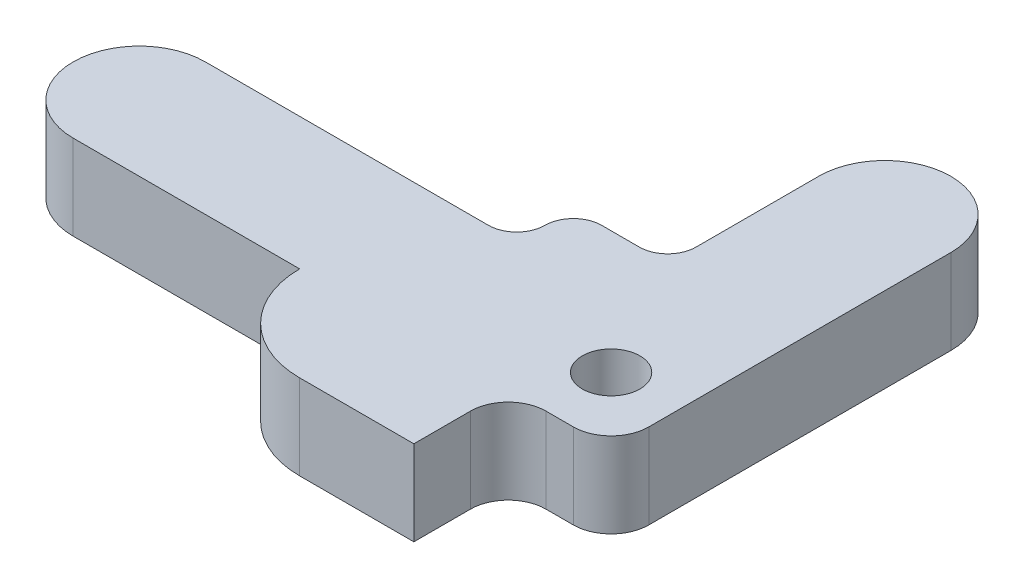
ISO-10303-21;
HEADER;
FILE_DESCRIPTION(('STEP AP214'),'2;1');
FILE_NAME('part.step','',(''),(''),'','','');
FILE_SCHEMA(('AUTOMOTIVE_DESIGN { 1 0 10303 214 1 1 1 1 }'));
ENDSEC;
DATA;
#1=APPLICATION_CONTEXT('core data for automotive mechanical design processes');
#2=APPLICATION_PROTOCOL_DEFINITION('international standard','automotive_design',2000,#1);
#3=PRODUCT_CONTEXT('',#1,'mechanical');
#4=PRODUCT('Part','Part','',(#3));
#5=PRODUCT_RELATED_PRODUCT_CATEGORY('part','',(#4));
#6=PRODUCT_DEFINITION_FORMATION('','',#4);
#7=PRODUCT_DEFINITION_CONTEXT('part definition',#1,'design');
#8=PRODUCT_DEFINITION('design','',#6,#7);
#9=PRODUCT_DEFINITION_SHAPE('','',#8);
#10=(LENGTH_UNIT() NAMED_UNIT(*) SI_UNIT(.MILLI.,.METRE.));
#11=(NAMED_UNIT(*) PLANE_ANGLE_UNIT() SI_UNIT($,.RADIAN.));
#12=(NAMED_UNIT(*) SI_UNIT($,.STERADIAN.) SOLID_ANGLE_UNIT());
#13=UNCERTAINTY_MEASURE_WITH_UNIT(LENGTH_MEASURE(1.E-05),#10,'distance_accuracy_value','');
#14=(GEOMETRIC_REPRESENTATION_CONTEXT(3) GLOBAL_UNCERTAINTY_ASSIGNED_CONTEXT((#13)) GLOBAL_UNIT_ASSIGNED_CONTEXT((#10,
#11,#12)) REPRESENTATION_CONTEXT('',''));
#15=CARTESIAN_POINT('',(0.,0.,0.));
#16=DIRECTION('',(0.,0.,1.));
#17=DIRECTION('',(1.,0.,0.));
#18=AXIS2_PLACEMENT_3D('',#15,#16,#17);
#19=CARTESIAN_POINT('',(0.,4.5,8.5));
#20=DIRECTION('',(0.,0.,1.));
#21=DIRECTION('',(1.,0.,0.));
#22=AXIS2_PLACEMENT_3D('',#19,#20,#21);
#23=PLANE('',#22);
#24=DIRECTION('',(-1.,0.,0.));
#25=VECTOR('',#24,1.);
#26=CARTESIAN_POINT('',(0.,4.5,8.5));
#27=LINE('',#26,#25);
#28=CARTESIAN_POINT('',(-1.95,4.5,8.5));
#29=VERTEX_POINT('',#28);
#30=CARTESIAN_POINT('',(-8.,4.5,8.5));
#31=VERTEX_POINT('',#30);
#32=EDGE_CURVE('E243',#29,#31,#27,.T.);
#33=ORIENTED_EDGE('',*,*,#32,.T.);
#34=DIRECTION('',(0.,-1.,0.));
#35=VECTOR('',#34,1.);
#36=CARTESIAN_POINT('',(-8.,4.5,8.5));
#37=LINE('',#36,#35);
#38=CARTESIAN_POINT('',(-8.,0.,8.5));
#39=VERTEX_POINT('',#38);
#40=EDGE_CURVE('E393',#31,#39,#37,.T.);
#41=ORIENTED_EDGE('',*,*,#40,.T.);
#42=DIRECTION('',(-1.,0.,0.));
#43=VECTOR('',#42,1.);
#44=CARTESIAN_POINT('',(0.,0.,8.5));
#45=LINE('',#44,#43);
#46=CARTESIAN_POINT('',(-1.95,0.,8.5));
#47=VERTEX_POINT('',#46);
#48=EDGE_CURVE('E276',#47,#39,#45,.T.);
#49=ORIENTED_EDGE('',*,*,#48,.F.);
#50=DIRECTION('',(0.,-1.,0.));
#51=VECTOR('',#50,1.);
#52=CARTESIAN_POINT('',(-1.95,4.5,8.5));
#53=LINE('',#52,#51);
#54=EDGE_CURVE('E302',#29,#47,#53,.T.);
#55=ORIENTED_EDGE('',*,*,#54,.F.);
#56=EDGE_LOOP('',(#33,#41,#49,#55));
#57=FACE_BOUND('',#56,.T.);
#58=ADVANCED_FACE('F41',(#57),#23,.T.);
#59=CARTESIAN_POINT('',(-1.95,4.5,0.));
#60=DIRECTION('',(-1.,0.,0.));
#61=DIRECTION('',(0.,0.,1.));
#62=AXIS2_PLACEMENT_3D('',#59,#60,#61);
#63=PLANE('',#62);
#64=DIRECTION('',(0.,0.,-1.));
#65=VECTOR('',#64,1.);
#66=CARTESIAN_POINT('',(-1.95,0.,0.));
#67=LINE('',#66,#65);
#68=CARTESIAN_POINT('',(-1.95,0.,5.5));
#69=VERTEX_POINT('',#68);
#70=EDGE_CURVE('E280',#47,#69,#67,.T.);
#71=ORIENTED_EDGE('',*,*,#70,.T.);
#72=DIRECTION('',(0.,-1.,0.));
#73=VECTOR('',#72,1.);
#74=CARTESIAN_POINT('',(-1.95,4.5,5.5));
#75=LINE('',#74,#73);
#76=CARTESIAN_POINT('',(-1.95,4.5,5.5));
#77=VERTEX_POINT('',#76);
#78=EDGE_CURVE('E57',#69,#77,#75,.F.);
#79=ORIENTED_EDGE('',*,*,#78,.T.);
#80=DIRECTION('',(0.,0.,-1.));
#81=VECTOR('',#80,1.);
#82=CARTESIAN_POINT('',(-1.95,4.5,0.));
#83=LINE('',#82,#81);
#84=EDGE_CURVE('E248',#29,#77,#83,.T.);
#85=ORIENTED_EDGE('',*,*,#84,.F.);
#86=ORIENTED_EDGE('',*,*,#54,.T.);
#87=EDGE_LOOP('',(#71,#79,#85,#86));
#88=FACE_BOUND('',#87,.T.);
#89=ADVANCED_FACE('F432',(#88),#63,.F.);
#90=CARTESIAN_POINT('',(0.,4.5,3.5));
#91=DIRECTION('',(0.,0.,-1.));
#92=DIRECTION('',(-1.,0.,0.));
#93=AXIS2_PLACEMENT_3D('',#90,#91,#92);
#94=PLANE('',#93);
#95=DIRECTION('',(1.,0.,0.));
#96=VECTOR('',#95,1.);
#97=CARTESIAN_POINT('',(0.,0.,3.5));
#98=LINE('',#97,#96);
#99=CARTESIAN_POINT('',(0.050000000000001,0.,3.5));
#100=VERTEX_POINT('',#99);
#101=CARTESIAN_POINT('',(1.50000000000125,0.,3.5));
#102=VERTEX_POINT('',#101);
#103=EDGE_CURVE('E283',#100,#102,#98,.T.);
#104=ORIENTED_EDGE('',*,*,#103,.T.);
#105=DIRECTION('',(0.,-1.,0.));
#106=VECTOR('',#105,1.);
#107=CARTESIAN_POINT('',(1.50000000000125,4.5,3.5));
#108=LINE('',#107,#106);
#109=CARTESIAN_POINT('',(1.50000000000125,4.5,3.5));
#110=VERTEX_POINT('',#109);
#111=EDGE_CURVE('E65',#102,#110,#108,.F.);
#112=ORIENTED_EDGE('',*,*,#111,.T.);
#113=DIRECTION('',(1.,0.,0.));
#114=VECTOR('',#113,1.);
#115=CARTESIAN_POINT('',(0.,4.5,3.5));
#116=LINE('',#115,#114);
#117=CARTESIAN_POINT('',(0.050000000000001,4.5,3.5));
#118=VERTEX_POINT('',#117);
#119=EDGE_CURVE('E251',#118,#110,#116,.T.);
#120=ORIENTED_EDGE('',*,*,#119,.F.);
#121=DIRECTION('',(0.,-1.,0.));
#122=VECTOR('',#121,1.);
#123=CARTESIAN_POINT('',(0.050000000000001,0.,3.5));
#124=LINE('',#123,#122);
#125=EDGE_CURVE('E413',#118,#100,#124,.T.);
#126=ORIENTED_EDGE('',*,*,#125,.T.);
#127=EDGE_LOOP('',(#104,#112,#120,#126));
#128=FACE_BOUND('',#127,.T.);
#129=ADVANCED_FACE('F438',(#128),#94,.F.);
#130=CARTESIAN_POINT('',(3.50000000000125,4.5,0.));
#131=DIRECTION('',(-1.,0.,0.));
#132=DIRECTION('',(0.,0.,1.));
#133=AXIS2_PLACEMENT_3D('',#130,#131,#132);
#134=PLANE('',#133);
#135=DIRECTION('',(0.,0.,-1.));
#136=VECTOR('',#135,1.);
#137=CARTESIAN_POINT('',(3.50000000000125,4.5,0.));
#138=LINE('',#137,#136);
#139=CARTESIAN_POINT('',(3.50000000000125,4.5,1.5));
#140=VERTEX_POINT('',#139);
#141=CARTESIAN_POINT('',(3.50000000000125,4.5,-14.5));
#142=VERTEX_POINT('',#141);
#143=EDGE_CURVE('E254',#140,#142,#138,.T.);
#144=ORIENTED_EDGE('',*,*,#143,.F.);
#145=DIRECTION('',(0.,-1.,0.));
#146=VECTOR('',#145,1.);
#147=CARTESIAN_POINT('',(3.50000000000125,4.5,1.5));
#148=LINE('',#147,#146);
#149=CARTESIAN_POINT('',(3.50000000000125,0.,1.5));
#150=VERTEX_POINT('',#149);
#151=EDGE_CURVE('E406',#140,#150,#148,.T.);
#152=ORIENTED_EDGE('',*,*,#151,.T.);
#153=DIRECTION('',(0.,0.,-1.));
#154=VECTOR('',#153,1.);
#155=CARTESIAN_POINT('',(3.50000000000125,0.,0.));
#156=LINE('',#155,#154);
#157=CARTESIAN_POINT('',(3.50000000000125,0.,-14.5));
#158=VERTEX_POINT('',#157);
#159=EDGE_CURVE('E286',#150,#158,#156,.T.);
#160=ORIENTED_EDGE('',*,*,#159,.T.);
#161=DIRECTION('',(0.,-1.,0.));
#162=VECTOR('',#161,1.);
#163=CARTESIAN_POINT('',(3.50000000000125,4.5,-14.5));
#164=LINE('',#163,#162);
#165=EDGE_CURVE('E339',#158,#142,#164,.F.);
#166=ORIENTED_EDGE('',*,*,#165,.T.);
#167=EDGE_LOOP('',(#144,#152,#160,#166));
#168=FACE_BOUND('',#167,.T.);
#169=ADVANCED_FACE('F445',(#168),#134,.F.);
#170=CARTESIAN_POINT('',(-3.5,4.5,0.));
#171=DIRECTION('',(1.,0.,0.));
#172=DIRECTION('',(0.,0.,-1.));
#173=AXIS2_PLACEMENT_3D('',#170,#171,#172);
#174=PLANE('',#173);
#175=DIRECTION('',(0.,0.,1.));
#176=VECTOR('',#175,1.);
#177=CARTESIAN_POINT('',(-3.5,0.,0.));
#178=LINE('',#177,#176);
#179=CARTESIAN_POINT('',(-3.5,0.,-14.5));
#180=VERTEX_POINT('',#179);
#181=CARTESIAN_POINT('',(-3.5,0.,-8.));
#182=VERTEX_POINT('',#181);
#183=EDGE_CURVE('E289',#180,#182,#178,.T.);
#184=ORIENTED_EDGE('',*,*,#183,.T.);
#185=DIRECTION('',(0.,-1.,0.));
#186=VECTOR('',#185,1.);
#187=CARTESIAN_POINT('',(-3.5,4.5,-8.));
#188=LINE('',#187,#186);
#189=CARTESIAN_POINT('',(-3.5,4.5,-8.));
#190=VERTEX_POINT('',#189);
#191=EDGE_CURVE('E375',#182,#190,#188,.F.);
#192=ORIENTED_EDGE('',*,*,#191,.T.);
#193=DIRECTION('',(0.,0.,1.));
#194=VECTOR('',#193,1.);
#195=CARTESIAN_POINT('',(-3.5,4.5,0.));
#196=LINE('',#195,#194);
#197=CARTESIAN_POINT('',(-3.5,4.5,-14.5));
#198=VERTEX_POINT('',#197);
#199=EDGE_CURVE('E257',#198,#190,#196,.T.);
#200=ORIENTED_EDGE('',*,*,#199,.F.);
#201=DIRECTION('',(0.,-1.,0.));
#202=VECTOR('',#201,1.);
#203=CARTESIAN_POINT('',(-3.5,4.5,-14.5));
#204=LINE('',#203,#202);
#205=EDGE_CURVE('E343',#198,#180,#204,.T.);
#206=ORIENTED_EDGE('',*,*,#205,.T.);
#207=EDGE_LOOP('',(#184,#192,#200,#206));
#208=FACE_BOUND('',#207,.T.);
#209=ADVANCED_FACE('F459',(#208),#174,.F.);
#210=CARTESIAN_POINT('',(0.,4.5,-6.5));
#211=DIRECTION('',(0.,0.,1.));
#212=DIRECTION('',(1.,0.,0.));
#213=AXIS2_PLACEMENT_3D('',#210,#211,#212);
#214=PLANE('',#213);
#215=DIRECTION('',(-1.,0.,0.));
#216=VECTOR('',#215,1.);
#217=CARTESIAN_POINT('',(-3.5,-4.,-6.5));
#218=LINE('',#217,#216);
#219=CARTESIAN_POINT('',(-3.5,-4.,-6.5));
#220=VERTEX_POINT('',#219);
#221=CARTESIAN_POINT('',(-7.,-4.,-6.5));
#222=VERTEX_POINT('',#221);
#223=EDGE_CURVE('E204',#220,#222,#218,.T.);
#224=ORIENTED_EDGE('',*,*,#223,.T.);
#225=DIRECTION('',(0.,-1.,0.));
#226=VECTOR('',#225,1.);
#227=CARTESIAN_POINT('',(-7.,4.5,-6.5));
#228=LINE('',#227,#226);
#229=CARTESIAN_POINT('',(-7.,4.5,-6.5));
#230=VERTEX_POINT('',#229);
#231=EDGE_CURVE('E369',#222,#230,#228,.F.);
#232=ORIENTED_EDGE('',*,*,#231,.T.);
#233=DIRECTION('',(-1.,0.,0.));
#234=VECTOR('',#233,1.);
#235=CARTESIAN_POINT('',(0.,4.5,-6.5));
#236=LINE('',#235,#234);
#237=CARTESIAN_POINT('',(-5.,4.5,-6.5));
#238=VERTEX_POINT('',#237);
#239=EDGE_CURVE('E261',#238,#230,#236,.T.);
#240=ORIENTED_EDGE('',*,*,#239,.F.);
#241=DIRECTION('',(0.,-1.,0.));
#242=VECTOR('',#241,1.);
#243=CARTESIAN_POINT('',(-5.,0.,-6.5));
#244=LINE('',#243,#242);
#245=CARTESIAN_POINT('',(-5.,0.,-6.5));
#246=VERTEX_POINT('',#245);
#247=EDGE_CURVE('E365',#238,#246,#244,.T.);
#248=ORIENTED_EDGE('',*,*,#247,.T.);
#249=DIRECTION('',(1.,0.,0.));
#250=VECTOR('',#249,1.);
#251=CARTESIAN_POINT('',(0.,0.,-6.5));
#252=LINE('',#251,#250);
#253=CARTESIAN_POINT('',(-3.5,0.,-6.5));
#254=VERTEX_POINT('',#253);
#255=EDGE_CURVE('E362',#246,#254,#252,.T.);
#256=ORIENTED_EDGE('',*,*,#255,.T.);
#257=DIRECTION('',(0.,1.,0.));
#258=VECTOR('',#257,1.);
#259=CARTESIAN_POINT('',(-3.5,-4.,-6.5));
#260=LINE('',#259,#258);
#261=EDGE_CURVE('E232',#220,#254,#260,.T.);
#262=ORIENTED_EDGE('',*,*,#261,.F.);
#263=EDGE_LOOP('',(#224,#232,#240,#248,#256,#262));
#264=FACE_BOUND('',#263,.T.);
#265=ADVANCED_FACE('F470',(#264),#214,.F.);
#266=CARTESIAN_POINT('',(-8.5,4.5,0.));
#267=DIRECTION('',(1.,0.,0.));
#268=DIRECTION('',(0.,0.,-1.));
#269=AXIS2_PLACEMENT_3D('',#266,#267,#268);
#270=PLANE('',#269);
#271=DIRECTION('',(0.,0.,-1.));
#272=VECTOR('',#271,1.);
#273=CARTESIAN_POINT('',(-8.5,0.,0.));
#274=LINE('',#273,#272);
#275=CARTESIAN_POINT('',(-8.5,0.,-3.5));
#276=VERTEX_POINT('',#275);
#277=CARTESIAN_POINT('',(-8.5,0.,-5.));
#278=VERTEX_POINT('',#277);
#279=EDGE_CURVE('E346',#276,#278,#274,.T.);
#280=ORIENTED_EDGE('',*,*,#279,.T.);
#281=DIRECTION('',(0.,-1.,0.));
#282=VECTOR('',#281,1.);
#283=CARTESIAN_POINT('',(-8.5,4.5,-5.));
#284=LINE('',#283,#282);
#285=CARTESIAN_POINT('',(-8.5,-4.,-5.));
#286=VERTEX_POINT('',#285);
#287=EDGE_CURVE('E199',#278,#286,#284,.T.);
#288=ORIENTED_EDGE('',*,*,#287,.T.);
#289=DIRECTION('',(0.,0.,1.));
#290=VECTOR('',#289,1.);
#291=CARTESIAN_POINT('',(-8.5,-4.,-6.5));
#292=LINE('',#291,#290);
#293=CARTESIAN_POINT('',(-8.5,-4.,-3.5));
#294=VERTEX_POINT('',#293);
#295=EDGE_CURVE('E192',#286,#294,#292,.T.);
#296=ORIENTED_EDGE('',*,*,#295,.T.);
#297=DIRECTION('',(0.,1.,0.));
#298=VECTOR('',#297,1.);
#299=CARTESIAN_POINT('',(-8.5,-4.,-3.5));
#300=LINE('',#299,#298);
#301=EDGE_CURVE('E196',#294,#276,#300,.T.);
#302=ORIENTED_EDGE('',*,*,#301,.T.);
#303=EDGE_LOOP('',(#280,#288,#296,#302));
#304=FACE_BOUND('',#303,.T.);
#305=ADVANCED_FACE('F195',(#304),#270,.F.);
#306=CARTESIAN_POINT('',(0.,4.5,-3.5));
#307=DIRECTION('',(0.,0.,1.));
#308=DIRECTION('',(1.,0.,0.));
#309=AXIS2_PLACEMENT_3D('',#306,#307,#308);
#310=PLANE('',#309);
#311=DIRECTION('',(-1.,0.,0.));
#312=VECTOR('',#311,1.);
#313=CARTESIAN_POINT('',(0.,4.5,-3.5));
#314=LINE('',#313,#312);
#315=CARTESIAN_POINT('',(-10.,4.5,-3.5));
#316=VERTEX_POINT('',#315);
#317=CARTESIAN_POINT('',(-25.0000000000015,4.5,-3.5));
#318=VERTEX_POINT('',#317);
#319=EDGE_CURVE('E265',#316,#318,#314,.T.);
#320=ORIENTED_EDGE('',*,*,#319,.F.);
#321=DIRECTION('',(0.,-1.,0.));
#322=VECTOR('',#321,1.);
#323=CARTESIAN_POINT('',(-10.,0.,-3.5));
#324=LINE('',#323,#322);
#325=CARTESIAN_POINT('',(-10.,0.,-3.5));
#326=VERTEX_POINT('',#325);
#327=EDGE_CURVE('E378',#316,#326,#324,.T.);
#328=ORIENTED_EDGE('',*,*,#327,.T.);
#329=DIRECTION('',(-1.,0.,0.));
#330=VECTOR('',#329,1.);
#331=CARTESIAN_POINT('',(0.,0.,-3.5));
#332=LINE('',#331,#330);
#333=CARTESIAN_POINT('',(-25.0000000000015,0.,-3.5));
#334=VERTEX_POINT('',#333);
#335=EDGE_CURVE('E293',#326,#334,#332,.T.);
#336=ORIENTED_EDGE('',*,*,#335,.T.);
#337=DIRECTION('',(0.,-1.,0.));
#338=VECTOR('',#337,1.);
#339=CARTESIAN_POINT('',(-25.0000000000015,4.5,-3.5));
#340=LINE('',#339,#338);
#341=EDGE_CURVE('E335',#334,#318,#340,.F.);
#342=ORIENTED_EDGE('',*,*,#341,.T.);
#343=EDGE_LOOP('',(#320,#328,#336,#342));
#344=FACE_BOUND('',#343,.T.);
#345=ADVANCED_FACE('F483',(#344),#310,.F.);
#346=CARTESIAN_POINT('',(0.,4.5,3.50000000000003));
#347=DIRECTION('',(0.,0.,1.));
#348=DIRECTION('',(1.,0.,0.));
#349=AXIS2_PLACEMENT_3D('',#346,#347,#348);
#350=PLANE('',#349);
#351=DIRECTION('',(-1.,0.,0.));
#352=VECTOR('',#351,1.);
#353=CARTESIAN_POINT('',(0.,4.5,3.50000000000003));
#354=LINE('',#353,#352);
#355=CARTESIAN_POINT('',(-13.,4.5,3.5));
#356=VERTEX_POINT('',#355);
#357=CARTESIAN_POINT('',(-25.0000000000015,4.5,3.50000000000001));
#358=VERTEX_POINT('',#357);
#359=EDGE_CURVE('E268',#356,#358,#354,.T.);
#360=ORIENTED_EDGE('',*,*,#359,.T.);
#361=DIRECTION('',(0.,-1.,0.));
#362=VECTOR('',#361,1.);
#363=CARTESIAN_POINT('',(-25.0000000000015,4.5,3.50000000000001));
#364=LINE('',#363,#362);
#365=CARTESIAN_POINT('',(-25.0000000000015,0.,3.50000000000001));
#366=VERTEX_POINT('',#365);
#367=EDGE_CURVE('E305',#358,#366,#364,.T.);
#368=ORIENTED_EDGE('',*,*,#367,.T.);
#369=DIRECTION('',(-1.,0.,0.));
#370=VECTOR('',#369,1.);
#371=CARTESIAN_POINT('',(0.,0.,3.50000000000003));
#372=LINE('',#371,#370);
#373=CARTESIAN_POINT('',(-13.,0.,3.5));
#374=VERTEX_POINT('',#373);
#375=EDGE_CURVE('E244',#374,#366,#372,.T.);
#376=ORIENTED_EDGE('',*,*,#375,.F.);
#377=DIRECTION('',(0.,-1.,0.));
#378=VECTOR('',#377,1.);
#379=CARTESIAN_POINT('',(-13.,4.5,3.5));
#380=LINE('',#379,#378);
#381=EDGE_CURVE('E272',#356,#374,#380,.T.);
#382=ORIENTED_EDGE('',*,*,#381,.F.);
#383=EDGE_LOOP('',(#360,#368,#376,#382));
#384=FACE_BOUND('',#383,.T.);
#385=ADVANCED_FACE('F496',(#384),#350,.T.);
#386=CARTESIAN_POINT('',(0.,4.5,0.));
#387=DIRECTION('',(0.,-1.,0.));
#388=DIRECTION('',(0.,0.,-1.));
#389=AXIS2_PLACEMENT_3D('',#386,#387,#388);
#390=CYLINDRICAL_SURFACE('',#389,1.525);
#391=CARTESIAN_POINT('',(0.,4.5,0.));
#392=DIRECTION('',(0.,1.,0.));
#393=DIRECTION('',(0.,0.,1.));
#394=AXIS2_PLACEMENT_3D('',#391,#392,#393);
#395=CIRCLE('',#394,1.525);
#396=CARTESIAN_POINT('',(0.,4.5,1.525));
#397=VERTEX_POINT('',#396);
#398=EDGE_CURVE('E239',#397,#397,#395,.T.);
#399=ORIENTED_EDGE('',*,*,#398,.T.);
#400=EDGE_LOOP('',(#399));
#401=FACE_BOUND('',#400,.T.);
#402=CARTESIAN_POINT('',(0.,0.,0.));
#403=DIRECTION('',(0.,1.,0.));
#404=DIRECTION('',(0.,0.,1.));
#405=AXIS2_PLACEMENT_3D('',#402,#403,#404);
#406=CIRCLE('',#405,1.525);
#407=CARTESIAN_POINT('',(0.,0.,1.525));
#408=VERTEX_POINT('',#407);
#409=EDGE_CURVE('E236',#408,#408,#406,.T.);
#410=ORIENTED_EDGE('',*,*,#409,.F.);
#411=EDGE_LOOP('',(#410));
#412=FACE_BOUND('',#411,.T.);
#413=ADVANCED_FACE('F516',(#401,#412),#390,.F.);
#414=CARTESIAN_POINT('',(0.,4.5,0.));
#415=DIRECTION('',(0.,1.,0.));
#416=DIRECTION('',(0.,0.,1.));
#417=AXIS2_PLACEMENT_3D('',#414,#415,#416);
#418=PLANE('',#417);
#419=ORIENTED_EDGE('',*,*,#398,.F.);
#420=EDGE_LOOP('',(#419));
#421=FACE_BOUND('',#420,.T.);
#422=ORIENTED_EDGE('',*,*,#119,.T.);
#423=CARTESIAN_POINT('',(1.50000000000125,4.5,1.5));
#424=DIRECTION('',(0.,1.,0.));
#425=DIRECTION('',(0.,0.,1.));
#426=AXIS2_PLACEMENT_3D('',#423,#424,#425);
#427=CIRCLE('',#426,2.);
#428=EDGE_CURVE('E419',#110,#140,#427,.T.);
#429=ORIENTED_EDGE('',*,*,#428,.T.);
#430=ORIENTED_EDGE('',*,*,#143,.T.);
#431=CARTESIAN_POINT('',(1.25116930704827E-12,4.5,-14.5));
#432=DIRECTION('',(0.,1.,0.));
#433=DIRECTION('',(0.,0.,1.));
#434=AXIS2_PLACEMENT_3D('',#431,#432,#433);
#435=CIRCLE('',#434,3.5);
#436=CARTESIAN_POINT('',(0.,4.5,-18.));
#437=VERTEX_POINT('',#436);
#438=EDGE_CURVE('E326',#142,#437,#435,.T.);
#439=ORIENTED_EDGE('',*,*,#438,.T.);
#440=CARTESIAN_POINT('',(0.,4.5,-14.5));
#441=DIRECTION('',(0.,1.,0.));
#442=DIRECTION('',(0.,0.,1.));
#443=AXIS2_PLACEMENT_3D('',#440,#441,#442);
#444=CIRCLE('',#443,3.5);
#445=EDGE_CURVE('E323',#437,#198,#444,.T.);
#446=ORIENTED_EDGE('',*,*,#445,.T.);
#447=ORIENTED_EDGE('',*,*,#199,.T.);
#448=CARTESIAN_POINT('',(-5.,4.5,-8.));
#449=DIRECTION('',(0.,1.,0.));
#450=DIRECTION('',(0.,0.,1.));
#451=AXIS2_PLACEMENT_3D('',#448,#449,#450);
#452=CIRCLE('',#451,1.5);
#453=EDGE_CURVE('E384',#190,#238,#452,.F.);
#454=ORIENTED_EDGE('',*,*,#453,.T.);
#455=ORIENTED_EDGE('',*,*,#239,.T.);
#456=CARTESIAN_POINT('',(-7.,4.5,-5.));
#457=DIRECTION('',(0.,1.,0.));
#458=DIRECTION('',(0.,0.,1.));
#459=AXIS2_PLACEMENT_3D('',#456,#457,#458);
#460=CIRCLE('',#459,1.5);
#461=CARTESIAN_POINT('',(-8.5,4.5,-5.));
#462=VERTEX_POINT('',#461);
#463=EDGE_CURVE('E372',#230,#462,#460,.T.);
#464=ORIENTED_EDGE('',*,*,#463,.T.);
#465=CARTESIAN_POINT('',(-10.,4.5,-5.));
#466=DIRECTION('',(0.,1.,0.));
#467=DIRECTION('',(0.,0.,1.));
#468=AXIS2_PLACEMENT_3D('',#465,#466,#467);
#469=CIRCLE('',#468,1.5);
#470=EDGE_CURVE('E390',#462,#316,#469,.F.);
#471=ORIENTED_EDGE('',*,*,#470,.T.);
#472=ORIENTED_EDGE('',*,*,#319,.T.);
#473=CARTESIAN_POINT('',(-25.0000000000015,4.5,0.));
#474=DIRECTION('',(0.,1.,0.));
#475=DIRECTION('',(0.,0.,1.));
#476=AXIS2_PLACEMENT_3D('',#473,#474,#475);
#477=CIRCLE('',#476,3.5);
#478=CARTESIAN_POINT('',(-28.5000000000015,4.5,0.));
#479=VERTEX_POINT('',#478);
#480=EDGE_CURVE('E329',#318,#479,#477,.T.);
#481=ORIENTED_EDGE('',*,*,#480,.T.);
#482=CARTESIAN_POINT('',(-25.0000000000015,4.5,0.));
#483=DIRECTION('',(0.,1.,0.));
#484=DIRECTION('',(0.,0.,1.));
#485=AXIS2_PLACEMENT_3D('',#482,#483,#484);
#486=CIRCLE('',#485,3.5);
#487=EDGE_CURVE('E332',#479,#358,#486,.T.);
#488=ORIENTED_EDGE('',*,*,#487,.T.);
#489=ORIENTED_EDGE('',*,*,#359,.F.);
#490=CARTESIAN_POINT('',(-8.,4.5,3.5));
#491=DIRECTION('',(0.,1.,0.));
#492=DIRECTION('',(0.,0.,1.));
#493=AXIS2_PLACEMENT_3D('',#490,#491,#492);
#494=CIRCLE('',#493,5.);
#495=EDGE_CURVE('E403',#356,#31,#494,.T.);
#496=ORIENTED_EDGE('',*,*,#495,.T.);
#497=ORIENTED_EDGE('',*,*,#32,.F.);
#498=ORIENTED_EDGE('',*,*,#84,.T.);
#499=CARTESIAN_POINT('',(0.050000000000001,4.5,5.5));
#500=DIRECTION('',(0.,1.,0.));
#501=DIRECTION('',(0.,0.,1.));
#502=AXIS2_PLACEMENT_3D('',#499,#500,#501);
#503=CIRCLE('',#502,2.);
#504=EDGE_CURVE('E11',#77,#118,#503,.F.);
#505=ORIENTED_EDGE('',*,*,#504,.T.);
#506=EDGE_LOOP('',(#422,#429,#430,#439,#446,#447,#454,#455,#464,#471,#472,#481,#488,#489,#496,
#497,#498,#505));
#507=FACE_BOUND('',#506,.T.);
#508=ADVANCED_FACE('F435',(#421,#507),#418,.T.);
#509=CARTESIAN_POINT('',(0.,0.,0.));
#510=DIRECTION('',(0.,1.,0.));
#511=DIRECTION('',(0.,0.,1.));
#512=AXIS2_PLACEMENT_3D('',#509,#510,#511);
#513=PLANE('',#512);
#514=ORIENTED_EDGE('',*,*,#409,.T.);
#515=EDGE_LOOP('',(#514));
#516=FACE_BOUND('',#515,.T.);
#517=ORIENTED_EDGE('',*,*,#159,.F.);
#518=CARTESIAN_POINT('',(1.50000000000125,0.,1.5));
#519=DIRECTION('',(0.,1.,0.));
#520=DIRECTION('',(0.,0.,1.));
#521=AXIS2_PLACEMENT_3D('',#518,#519,#520);
#522=CIRCLE('',#521,2.);
#523=EDGE_CURVE('E410',#150,#102,#522,.F.);
#524=ORIENTED_EDGE('',*,*,#523,.T.);
#525=ORIENTED_EDGE('',*,*,#103,.F.);
#526=CARTESIAN_POINT('',(0.050000000000001,0.,5.5));
#527=DIRECTION('',(0.,1.,0.));
#528=DIRECTION('',(0.,0.,1.));
#529=AXIS2_PLACEMENT_3D('',#526,#527,#528);
#530=CIRCLE('',#529,2.);
#531=EDGE_CURVE('E50',#100,#69,#530,.T.);
#532=ORIENTED_EDGE('',*,*,#531,.T.);
#533=ORIENTED_EDGE('',*,*,#70,.F.);
#534=ORIENTED_EDGE('',*,*,#48,.T.);
#535=CARTESIAN_POINT('',(-8.,0.,3.5));
#536=DIRECTION('',(0.,1.,0.));
#537=DIRECTION('',(0.,0.,1.));
#538=AXIS2_PLACEMENT_3D('',#535,#536,#537);
#539=CIRCLE('',#538,5.);
#540=EDGE_CURVE('E400',#39,#374,#539,.F.);
#541=ORIENTED_EDGE('',*,*,#540,.T.);
#542=ORIENTED_EDGE('',*,*,#375,.T.);
#543=CARTESIAN_POINT('',(-25.0000000000015,0.,0.));
#544=DIRECTION('',(0.,1.,0.));
#545=DIRECTION('',(0.,0.,1.));
#546=AXIS2_PLACEMENT_3D('',#543,#544,#545);
#547=CIRCLE('',#546,3.5);
#548=CARTESIAN_POINT('',(-28.5000000000015,0.,0.));
#549=VERTEX_POINT('',#548);
#550=EDGE_CURVE('E320',#366,#549,#547,.F.);
#551=ORIENTED_EDGE('',*,*,#550,.T.);
#552=CARTESIAN_POINT('',(-25.0000000000015,0.,0.));
#553=DIRECTION('',(0.,1.,0.));
#554=DIRECTION('',(0.,0.,1.));
#555=AXIS2_PLACEMENT_3D('',#552,#553,#554);
#556=CIRCLE('',#555,3.5);
#557=EDGE_CURVE('E316',#549,#334,#556,.F.);
#558=ORIENTED_EDGE('',*,*,#557,.T.);
#559=ORIENTED_EDGE('',*,*,#335,.F.);
#560=CARTESIAN_POINT('',(-10.,0.,-5.));
#561=DIRECTION('',(0.,1.,0.));
#562=DIRECTION('',(0.,0.,1.));
#563=AXIS2_PLACEMENT_3D('',#560,#561,#562);
#564=CIRCLE('',#563,1.5);
#565=EDGE_CURVE('E387',#326,#278,#564,.T.);
#566=ORIENTED_EDGE('',*,*,#565,.T.);
#567=ORIENTED_EDGE('',*,*,#279,.F.);
#568=DIRECTION('',(1.,0.,0.));
#569=VECTOR('',#568,1.);
#570=CARTESIAN_POINT('',(-8.5,0.,-3.5));
#571=LINE('',#570,#569);
#572=CARTESIAN_POINT('',(-3.5,0.,-3.5));
#573=VERTEX_POINT('',#572);
#574=EDGE_CURVE('E211',#276,#573,#571,.T.);
#575=ORIENTED_EDGE('',*,*,#574,.T.);
#576=DIRECTION('',(0.,0.,-1.));
#577=VECTOR('',#576,1.);
#578=CARTESIAN_POINT('',(-3.5,0.,-3.5));
#579=LINE('',#578,#577);
#580=EDGE_CURVE('E227',#573,#254,#579,.T.);
#581=ORIENTED_EDGE('',*,*,#580,.T.);
#582=ORIENTED_EDGE('',*,*,#255,.F.);
#583=CARTESIAN_POINT('',(-5.,0.,-8.));
#584=DIRECTION('',(0.,1.,0.));
#585=DIRECTION('',(0.,0.,1.));
#586=AXIS2_PLACEMENT_3D('',#583,#584,#585);
#587=CIRCLE('',#586,1.5);
#588=EDGE_CURVE('E381',#246,#182,#587,.T.);
#589=ORIENTED_EDGE('',*,*,#588,.T.);
#590=ORIENTED_EDGE('',*,*,#183,.F.);
#591=CARTESIAN_POINT('',(0.,0.,-14.5));
#592=DIRECTION('',(0.,1.,0.));
#593=DIRECTION('',(0.,0.,1.));
#594=AXIS2_PLACEMENT_3D('',#591,#592,#593);
#595=CIRCLE('',#594,3.5);
#596=CARTESIAN_POINT('',(0.,0.,-18.));
#597=VERTEX_POINT('',#596);
#598=EDGE_CURVE('E309',#180,#597,#595,.F.);
#599=ORIENTED_EDGE('',*,*,#598,.T.);
#600=CARTESIAN_POINT('',(1.25116930704827E-12,0.,-14.5));
#601=DIRECTION('',(0.,1.,0.));
#602=DIRECTION('',(0.,0.,1.));
#603=AXIS2_PLACEMENT_3D('',#600,#601,#602);
#604=CIRCLE('',#603,3.5);
#605=EDGE_CURVE('E312',#597,#158,#604,.F.);
#606=ORIENTED_EDGE('',*,*,#605,.T.);
#607=EDGE_LOOP('',(#517,#524,#525,#532,#533,#534,#541,#542,#551,#558,#559,#566,#567,#575,#581,
#582,#589,#590,#599,#606));
#608=FACE_BOUND('',#607,.T.);
#609=ADVANCED_FACE('F428',(#516,#608),#513,.F.);
#610=CARTESIAN_POINT('',(-3.5,-4.,-3.5));
#611=DIRECTION('',(1.,0.,0.));
#612=DIRECTION('',(0.,0.,-1.));
#613=AXIS2_PLACEMENT_3D('',#610,#611,#612);
#614=PLANE('',#613);
#615=ORIENTED_EDGE('',*,*,#580,.F.);
#616=DIRECTION('',(0.,1.,0.));
#617=VECTOR('',#616,1.);
#618=CARTESIAN_POINT('',(-3.5,-4.,-3.5));
#619=LINE('',#618,#617);
#620=CARTESIAN_POINT('',(-3.5,-4.,-3.5));
#621=VERTEX_POINT('',#620);
#622=EDGE_CURVE('E213',#621,#573,#619,.T.);
#623=ORIENTED_EDGE('',*,*,#622,.F.);
#624=DIRECTION('',(0.,0.,-1.));
#625=VECTOR('',#624,1.);
#626=CARTESIAN_POINT('',(-3.5,-4.,-3.5));
#627=LINE('',#626,#625);
#628=EDGE_CURVE('E214',#621,#220,#627,.T.);
#629=ORIENTED_EDGE('',*,*,#628,.T.);
#630=ORIENTED_EDGE('',*,*,#261,.T.);
#631=EDGE_LOOP('',(#615,#623,#629,#630));
#632=FACE_BOUND('',#631,.T.);
#633=ADVANCED_FACE('F531',(#632),#614,.T.);
#634=CARTESIAN_POINT('',(-8.5,-4.,-3.5));
#635=DIRECTION('',(0.,0.,1.));
#636=DIRECTION('',(1.,0.,0.));
#637=AXIS2_PLACEMENT_3D('',#634,#635,#636);
#638=PLANE('',#637);
#639=ORIENTED_EDGE('',*,*,#574,.F.);
#640=ORIENTED_EDGE('',*,*,#301,.F.);
#641=DIRECTION('',(1.,0.,0.));
#642=VECTOR('',#641,1.);
#643=CARTESIAN_POINT('',(-8.5,-4.,-3.5));
#644=LINE('',#643,#642);
#645=EDGE_CURVE('E203',#294,#621,#644,.T.);
#646=ORIENTED_EDGE('',*,*,#645,.T.);
#647=ORIENTED_EDGE('',*,*,#622,.T.);
#648=EDGE_LOOP('',(#639,#640,#646,#647));
#649=FACE_BOUND('',#648,.T.);
#650=ADVANCED_FACE('F208',(#649),#638,.T.);
#651=CARTESIAN_POINT('',(0.,-4.,0.));
#652=DIRECTION('',(0.,1.,0.));
#653=DIRECTION('',(0.,0.,1.));
#654=AXIS2_PLACEMENT_3D('',#651,#652,#653);
#655=PLANE('',#654);
#656=ORIENTED_EDGE('',*,*,#295,.F.);
#657=CARTESIAN_POINT('',(-7.,-4.,-5.));
#658=DIRECTION('',(0.,1.,0.));
#659=DIRECTION('',(0.,0.,1.));
#660=AXIS2_PLACEMENT_3D('',#657,#658,#659);
#661=CIRCLE('',#660,1.5);
#662=EDGE_CURVE('E359',#286,#222,#661,.F.);
#663=ORIENTED_EDGE('',*,*,#662,.T.);
#664=ORIENTED_EDGE('',*,*,#223,.F.);
#665=ORIENTED_EDGE('',*,*,#628,.F.);
#666=ORIENTED_EDGE('',*,*,#645,.F.);
#667=EDGE_LOOP('',(#656,#663,#664,#665,#666));
#668=FACE_BOUND('',#667,.T.);
#669=ADVANCED_FACE('F216',(#668),#655,.F.);
#670=CARTESIAN_POINT('',(-25.0000000000015,4.5,0.));
#671=DIRECTION('',(0.,1.,0.));
#672=DIRECTION('',(0.,0.,1.));
#673=AXIS2_PLACEMENT_3D('',#670,#671,#672);
#674=CYLINDRICAL_SURFACE('',#673,3.5);
#675=DIRECTION('',(0.,-1.,0.));
#676=VECTOR('',#675,1.);
#677=CARTESIAN_POINT('',(-28.5000000000015,0.,0.));
#678=LINE('',#677,#676);
#679=EDGE_CURVE('E228',#479,#549,#678,.T.);
#680=ORIENTED_EDGE('',*,*,#679,.F.);
#681=ORIENTED_EDGE('',*,*,#480,.F.);
#682=ORIENTED_EDGE('',*,*,#341,.F.);
#683=ORIENTED_EDGE('',*,*,#557,.F.);
#684=EDGE_LOOP('',(#680,#681,#682,#683));
#685=FACE_BOUND('',#684,.T.);
#686=ADVANCED_FACE('F489',(#685),#674,.T.);
#687=CARTESIAN_POINT('',(-25.0000000000015,4.5,0.));
#688=DIRECTION('',(0.,-1.,0.));
#689=DIRECTION('',(0.,0.,-1.));
#690=AXIS2_PLACEMENT_3D('',#687,#688,#689);
#691=CYLINDRICAL_SURFACE('',#690,3.5);
#692=ORIENTED_EDGE('',*,*,#487,.F.);
#693=ORIENTED_EDGE('',*,*,#679,.T.);
#694=ORIENTED_EDGE('',*,*,#550,.F.);
#695=ORIENTED_EDGE('',*,*,#367,.F.);
#696=EDGE_LOOP('',(#692,#693,#694,#695));
#697=FACE_BOUND('',#696,.T.);
#698=ADVANCED_FACE('F498',(#697),#691,.T.);
#699=CARTESIAN_POINT('',(0.,4.5,-14.5));
#700=DIRECTION('',(0.,-1.,0.));
#701=DIRECTION('',(0.,0.,-1.));
#702=AXIS2_PLACEMENT_3D('',#699,#700,#701);
#703=CYLINDRICAL_SURFACE('',#702,3.5);
#704=ORIENTED_EDGE('',*,*,#205,.F.);
#705=ORIENTED_EDGE('',*,*,#445,.F.);
#706=DIRECTION('',(0.,-1.,0.));
#707=VECTOR('',#706,1.);
#708=CARTESIAN_POINT('',(0.,4.5,-18.));
#709=LINE('',#708,#707);
#710=EDGE_CURVE('E350',#597,#437,#709,.F.);
#711=ORIENTED_EDGE('',*,*,#710,.F.);
#712=ORIENTED_EDGE('',*,*,#598,.F.);
#713=EDGE_LOOP('',(#704,#705,#711,#712));
#714=FACE_BOUND('',#713,.T.);
#715=ADVANCED_FACE('F455',(#714),#703,.T.);
#716=CARTESIAN_POINT('',(1.25116930704827E-12,4.5,-14.5));
#717=DIRECTION('',(0.,-1.,0.));
#718=DIRECTION('',(0.,0.,-1.));
#719=AXIS2_PLACEMENT_3D('',#716,#717,#718);
#720=CYLINDRICAL_SURFACE('',#719,3.5);
#721=ORIENTED_EDGE('',*,*,#438,.F.);
#722=ORIENTED_EDGE('',*,*,#165,.F.);
#723=ORIENTED_EDGE('',*,*,#605,.F.);
#724=ORIENTED_EDGE('',*,*,#710,.T.);
#725=EDGE_LOOP('',(#721,#722,#723,#724));
#726=FACE_BOUND('',#725,.T.);
#727=ADVANCED_FACE('F449',(#726),#720,.T.);
#728=CARTESIAN_POINT('',(-10.,4.5,-5.));
#729=DIRECTION('',(0.,1.,0.));
#730=DIRECTION('',(0.,0.,1.));
#731=AXIS2_PLACEMENT_3D('',#728,#729,#730);
#732=CYLINDRICAL_SURFACE('',#731,1.5);
#733=ORIENTED_EDGE('',*,*,#327,.F.);
#734=ORIENTED_EDGE('',*,*,#470,.F.);
#735=DIRECTION('',(0.,-1.,0.));
#736=VECTOR('',#735,1.);
#737=CARTESIAN_POINT('',(-8.5,4.5,-5.));
#738=LINE('',#737,#736);
#739=EDGE_CURVE('E354',#278,#462,#738,.F.);
#740=ORIENTED_EDGE('',*,*,#739,.F.);
#741=ORIENTED_EDGE('',*,*,#565,.F.);
#742=EDGE_LOOP('',(#733,#734,#740,#741));
#743=FACE_BOUND('',#742,.T.);
#744=ADVANCED_FACE('F479',(#743),#732,.F.);
#745=CARTESIAN_POINT('',(-7.,4.5,-5.));
#746=DIRECTION('',(0.,-1.,0.));
#747=DIRECTION('',(0.,0.,-1.));
#748=AXIS2_PLACEMENT_3D('',#745,#746,#747);
#749=CYLINDRICAL_SURFACE('',#748,1.5);
#750=ORIENTED_EDGE('',*,*,#463,.F.);
#751=ORIENTED_EDGE('',*,*,#231,.F.);
#752=ORIENTED_EDGE('',*,*,#662,.F.);
#753=ORIENTED_EDGE('',*,*,#287,.F.);
#754=ORIENTED_EDGE('',*,*,#739,.T.);
#755=EDGE_LOOP('',(#750,#751,#752,#753,#754));
#756=FACE_BOUND('',#755,.T.);
#757=ADVANCED_FACE('F473',(#756),#749,.T.);
#758=CARTESIAN_POINT('',(-5.,4.5,-8.));
#759=DIRECTION('',(0.,1.,0.));
#760=DIRECTION('',(0.,0.,1.));
#761=AXIS2_PLACEMENT_3D('',#758,#759,#760);
#762=CYLINDRICAL_SURFACE('',#761,1.5);
#763=ORIENTED_EDGE('',*,*,#453,.F.);
#764=ORIENTED_EDGE('',*,*,#191,.F.);
#765=ORIENTED_EDGE('',*,*,#588,.F.);
#766=ORIENTED_EDGE('',*,*,#247,.F.);
#767=EDGE_LOOP('',(#763,#764,#765,#766));
#768=FACE_BOUND('',#767,.T.);
#769=ADVANCED_FACE('F465',(#768),#762,.F.);
#770=CARTESIAN_POINT('',(-8.,4.5,3.5));
#771=DIRECTION('',(0.,-1.,0.));
#772=DIRECTION('',(0.,0.,-1.));
#773=AXIS2_PLACEMENT_3D('',#770,#771,#772);
#774=CYLINDRICAL_SURFACE('',#773,5.);
#775=ORIENTED_EDGE('',*,*,#495,.F.);
#776=ORIENTED_EDGE('',*,*,#381,.T.);
#777=ORIENTED_EDGE('',*,*,#540,.F.);
#778=ORIENTED_EDGE('',*,*,#40,.F.);
#779=EDGE_LOOP('',(#775,#776,#777,#778));
#780=FACE_BOUND('',#779,.T.);
#781=ADVANCED_FACE('F591',(#780),#774,.T.);
#782=CARTESIAN_POINT('',(1.50000000000125,4.5,1.5));
#783=DIRECTION('',(0.,-1.,0.));
#784=DIRECTION('',(0.,0.,-1.));
#785=AXIS2_PLACEMENT_3D('',#782,#783,#784);
#786=CYLINDRICAL_SURFACE('',#785,2.);
#787=ORIENTED_EDGE('',*,*,#428,.F.);
#788=ORIENTED_EDGE('',*,*,#111,.F.);
#789=ORIENTED_EDGE('',*,*,#523,.F.);
#790=ORIENTED_EDGE('',*,*,#151,.F.);
#791=EDGE_LOOP('',(#787,#788,#789,#790));
#792=FACE_BOUND('',#791,.T.);
#793=ADVANCED_FACE('F440',(#792),#786,.T.);
#794=CARTESIAN_POINT('',(0.050000000000001,4.5,5.5));
#795=DIRECTION('',(0.,1.,0.));
#796=DIRECTION('',(0.,0.,1.));
#797=AXIS2_PLACEMENT_3D('',#794,#795,#796);
#798=CYLINDRICAL_SURFACE('',#797,2.);
#799=ORIENTED_EDGE('',*,*,#504,.F.);
#800=ORIENTED_EDGE('',*,*,#78,.F.);
#801=ORIENTED_EDGE('',*,*,#531,.F.);
#802=ORIENTED_EDGE('',*,*,#125,.F.);
#803=EDGE_LOOP('',(#799,#800,#801,#802));
#804=FACE_BOUND('',#803,.T.);
#805=ADVANCED_FACE('F43',(#804),#798,.F.);
#806=CLOSED_SHELL('',(#58,#89,#129,#169,#209,#265,#305,#345,#385,#413,#508,#609,#633,#650,#669,
#686,#698,#715,#727,#744,#757,#769,#781,#793,#805));
#807=MANIFOLD_SOLID_BREP('B2',#806);
#808=ADVANCED_BREP_SHAPE_REPRESENTATION('',(#18,#807),#14);
#809=SHAPE_DEFINITION_REPRESENTATION(#9,#808);
ENDSEC;
END-ISO-10303-21;
